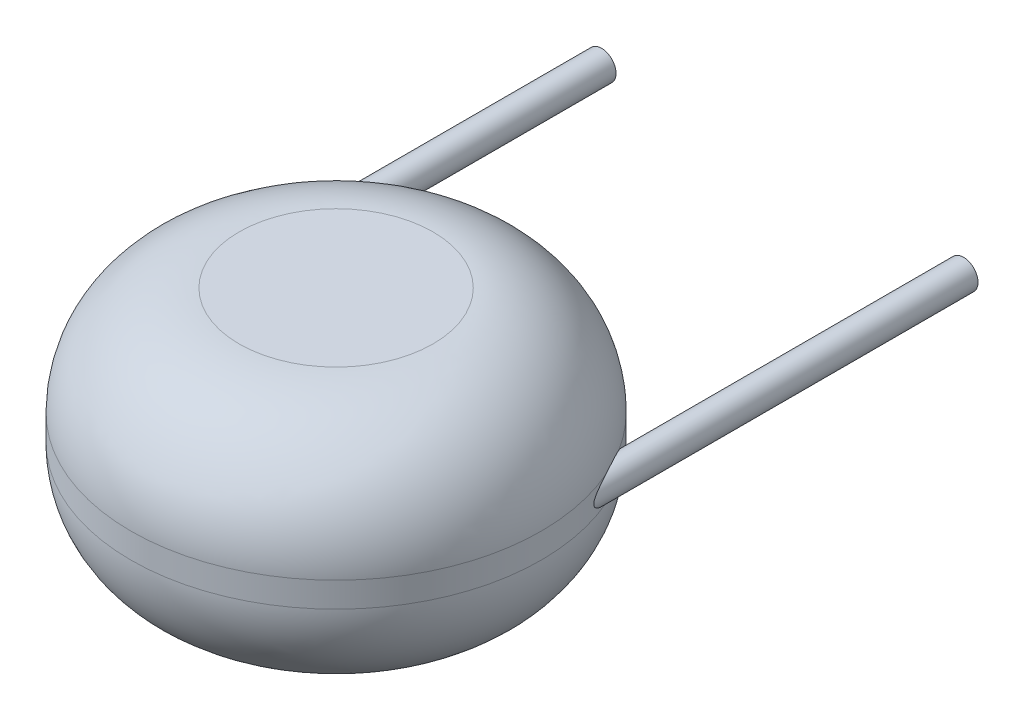
ISO-10303-21;
HEADER;
FILE_DESCRIPTION(('STEP AP214'),'2;1');
FILE_NAME('part.step','',(''),(''),'','','');
FILE_SCHEMA(('AUTOMOTIVE_DESIGN { 1 0 10303 214 1 1 1 1 }'));
ENDSEC;
DATA;
#1=APPLICATION_CONTEXT('core data for automotive mechanical design processes');
#2=APPLICATION_PROTOCOL_DEFINITION('international standard','automotive_design',2000,#1);
#3=PRODUCT_CONTEXT('',#1,'mechanical');
#4=PRODUCT('Part','Part','',(#3));
#5=PRODUCT_RELATED_PRODUCT_CATEGORY('part','',(#4));
#6=PRODUCT_DEFINITION_FORMATION('','',#4);
#7=PRODUCT_DEFINITION_CONTEXT('part definition',#1,'design');
#8=PRODUCT_DEFINITION('design','',#6,#7);
#9=PRODUCT_DEFINITION_SHAPE('','',#8);
#10=(LENGTH_UNIT() NAMED_UNIT(*) SI_UNIT(.MILLI.,.METRE.));
#11=(NAMED_UNIT(*) PLANE_ANGLE_UNIT() SI_UNIT($,.RADIAN.));
#12=(NAMED_UNIT(*) SI_UNIT($,.STERADIAN.) SOLID_ANGLE_UNIT());
#13=UNCERTAINTY_MEASURE_WITH_UNIT(LENGTH_MEASURE(1.E-05),#10,'distance_accuracy_value','');
#14=(GEOMETRIC_REPRESENTATION_CONTEXT(3) GLOBAL_UNCERTAINTY_ASSIGNED_CONTEXT((#13)) GLOBAL_UNIT_ASSIGNED_CONTEXT((#10,
#11,#12)) REPRESENTATION_CONTEXT('',''));
#15=CARTESIAN_POINT('',(0.,0.,0.));
#16=DIRECTION('',(0.,0.,1.));
#17=DIRECTION('',(1.,0.,0.));
#18=AXIS2_PLACEMENT_3D('',#15,#16,#17);
#19=CARTESIAN_POINT('',(3.75,2.5,-9.25));
#20=DIRECTION('',(0.,0.,1.));
#21=DIRECTION('',(1.,0.,0.));
#22=AXIS2_PLACEMENT_3D('',#19,#20,#21);
#23=PLANE('',#22);
#24=CARTESIAN_POINT('',(3.75,2.5,-9.25));
#25=DIRECTION('',(0.,0.,-1.));
#26=DIRECTION('',(-1.,0.,0.));
#27=AXIS2_PLACEMENT_3D('',#24,#25,#26);
#28=CIRCLE('',#27,0.3);
#29=CARTESIAN_POINT('',(3.45,2.5,-9.25));
#30=VERTEX_POINT('',#29);
#31=EDGE_CURVE('E85',#30,#30,#28,.F.);
#32=ORIENTED_EDGE('',*,*,#31,.F.);
#33=EDGE_LOOP('',(#32));
#34=FACE_BOUND('',#33,.T.);
#35=ADVANCED_FACE('F17',(#34),#23,.F.);
#36=CARTESIAN_POINT('',(-3.75,2.5,-9.25));
#37=DIRECTION('',(0.,0.,1.));
#38=DIRECTION('',(1.,0.,0.));
#39=AXIS2_PLACEMENT_3D('',#36,#37,#38);
#40=PLANE('',#39);
#41=CARTESIAN_POINT('',(-3.75,2.5,-9.25));
#42=DIRECTION('',(0.,0.,-1.));
#43=DIRECTION('',(-1.,0.,0.));
#44=AXIS2_PLACEMENT_3D('',#41,#42,#43);
#45=CIRCLE('',#44,0.3);
#46=CARTESIAN_POINT('',(-4.05,2.5,-9.25));
#47=VERTEX_POINT('',#46);
#48=EDGE_CURVE('E101',#47,#47,#45,.F.);
#49=ORIENTED_EDGE('',*,*,#48,.F.);
#50=EDGE_LOOP('',(#49));
#51=FACE_BOUND('',#50,.T.);
#52=ADVANCED_FACE('F296',(#51),#40,.F.);
#53=CARTESIAN_POINT('',(3.75,2.5,4.252));
#54=DIRECTION('',(0.,0.,-1.));
#55=DIRECTION('',(-1.,0.,0.));
#56=AXIS2_PLACEMENT_3D('',#53,#54,#55);
#57=CYLINDRICAL_SURFACE('',#56,0.3);
#58=ORIENTED_EDGE('',*,*,#31,.T.);
#59=EDGE_LOOP('',(#58));
#60=FACE_BOUND('',#59,.T.);
#61=CARTESIAN_POINT('',(3.60033370452902,2.24000000000001,-2.25833948201601));
#62=CARTESIAN_POINT('',(3.59237544483734,2.2445884658662,-2.27102890500092));
#63=CARTESIAN_POINT('',(3.58441716674587,2.24964989207986,-2.28356526340663));
#64=CARTESIAN_POINT('',(3.56855460706408,2.26088976595071,-2.30827475821931));
#65=CARTESIAN_POINT('',(3.5606508873999,2.26707438378381,-2.32044543242139));
#66=CARTESIAN_POINT('',(3.54491959964942,2.28079136736462,-2.34440913329731));
#67=CARTESIAN_POINT('',(3.53709525292746,2.28834364235866,-2.35619304952809));
#68=CARTESIAN_POINT('',(3.52183824347252,2.30488819253633,-2.37893713857757));
#69=CARTESIAN_POINT('',(3.51440462419498,2.31387671032246,-2.38989935405035));
#70=CARTESIAN_POINT('',(3.501390759545,2.33179245232067,-2.40891506163492));
#71=CARTESIAN_POINT('',(3.49571252736562,2.34046055958578,-2.41714347029881));
#72=CARTESIAN_POINT('',(3.48498989706261,2.35898989517244,-2.43257751782839));
#73=CARTESIAN_POINT('',(3.47994399408472,2.36884817676038,-2.43978559046512));
#74=CARTESIAN_POINT('',(3.47067666515606,2.3899416228602,-2.45295111440281));
#75=CARTESIAN_POINT('',(3.46646659419258,2.40119276675623,-2.45889141446202));
#76=CARTESIAN_POINT('',(3.45930435271853,2.42485033803064,-2.46895769046719));
#77=CARTESIAN_POINT('',(3.45634918462002,2.43725392511116,-2.47308799072578));
#78=CARTESIAN_POINT('',(3.45281836813062,2.45815517934173,-2.47801346990059));
#79=CARTESIAN_POINT('',(3.45176760436821,2.46641910712659,-2.47947613088059));
#80=CARTESIAN_POINT('',(3.45035803899449,2.48312047592162,-2.48143725312423));
#81=CARTESIAN_POINT('',(3.44999923192542,2.49155791556269,-2.48193572199289));
#82=CARTESIAN_POINT('',(3.45000108562384,2.51193234135139,-2.48193332594694));
#83=CARTESIAN_POINT('',(3.45072053037973,2.52387396207554,-2.48093409830958));
#84=CARTESIAN_POINT('',(3.4535140166007,2.54728450541962,-2.47704384980731));
#85=CARTESIAN_POINT('',(3.45559028293022,2.55875261870488,-2.47414972174178));
#86=CARTESIAN_POINT('',(3.46085324083906,2.58075310446595,-2.46678227448065));
#87=CARTESIAN_POINT('',(3.46402902513343,2.59129343786678,-2.46232446162049));
#88=CARTESIAN_POINT('',(3.47124532483038,2.61140076570065,-2.45214088984243));
#89=CARTESIAN_POINT('',(3.47528577312467,2.62096783558564,-2.44641522932351));
#90=CARTESIAN_POINT('',(3.48630686932364,2.64388263121362,-2.43069896625517));
#91=CARTESIAN_POINT('',(3.49371574426425,2.65656997634094,-2.42004972458041));
#92=CARTESIAN_POINT('',(3.5094641817965,2.67983725597844,-2.39715599540203));
#93=CARTESIAN_POINT('',(3.51780917010835,2.69040379798474,-2.38490213093792));
#94=CARTESIAN_POINT('',(3.53826127650273,2.71326747633494,-2.35449679855189));
#95=CARTESIAN_POINT('',(3.5505999314385,2.72471345764079,-2.33586451638099));
#96=CARTESIAN_POINT('',(3.56925970510122,2.73957117570398,-2.30716585765084));
#97=CARTESIAN_POINT('',(3.57545099344273,2.74410909155136,-2.29756041821087));
#98=CARTESIAN_POINT('',(3.58787032813877,2.75252706164641,-2.2781174163685));
#99=CARTESIAN_POINT('',(3.59409827959061,2.75640837812631,-2.26828034172332));
#100=CARTESIAN_POINT('',(3.60033370452902,2.75999999999999,-2.25833948201601));
#101=B_SPLINE_CURVE_WITH_KNOTS('',3,(#61,#62,#63,#64,#65,#66,#67,#68,#69,#70,#71,#72,#73,#74,
#75,#76,#77,#78,#79,#80,#81,#82,#83,#84,#85,#86,#87,#88,#89,#90,#91,#92,#93,#94,#95,#96,#97,#98,
#99,#100),.UNSPECIFIED.,.F.,.F.,(4,2,2,2,2,2,2,2,2,2,2,2,2,2,2,2,2,2,2,4),(0.,
0.0470106891256236,0.0942879015129488,0.142318612183013,0.190225665834799,0.229833753870268,
0.269345714012529,0.309362389662058,0.349282932276007,0.374578900701871,0.399874669606179,
0.435628605918173,0.471441317786004,0.506908488838162,0.542372908210544,0.596503046156255,
0.650964937877654,0.725974473698545,0.762849543623875,0.799652899690031),.UNSPECIFIED.);
#102=CARTESIAN_POINT('',(3.60033370452903,2.24000000000001,-2.25833948201599));
#103=VERTEX_POINT('',#102);
#104=CARTESIAN_POINT('',(3.60033370452902,2.76,-2.25833948201601));
#105=VERTEX_POINT('',#104);
#106=EDGE_CURVE('E69',#103,#105,#101,.T.);
#107=ORIENTED_EDGE('',*,*,#106,.T.);
#108=CARTESIAN_POINT('',(3.89966629547111,2.75999999999992,-1.68970493991307));
#109=CARTESIAN_POINT('',(3.88340026065117,2.76931981640486,-1.72724234266036));
#110=CARTESIAN_POINT('',(3.8663971647586,2.77711981512702,-1.7648538559337));
#111=CARTESIAN_POINT('',(3.83099810863401,2.78947983459557,-1.84014072611238));
#112=CARTESIAN_POINT('',(3.81259680514515,2.79402665535172,-1.87781572828809));
#113=CARTESIAN_POINT('',(3.77517376353951,2.79951924919928,-1.95173730869121));
#114=CARTESIAN_POINT('',(3.75618609511949,2.80056681325137,-1.98799335308594));
#115=CARTESIAN_POINT('',(3.71729418763469,2.79884681889486,-2.05986120906395));
#116=CARTESIAN_POINT('',(3.69739177774562,2.7960865792098,-2.0954741235953));
#117=CARTESIAN_POINT('',(3.66459612263311,2.78787838538539,-2.15230348002395));
#118=CARTESIAN_POINT('',(3.65191552232845,2.78385164927381,-2.17384461189075));
#119=CARTESIAN_POINT('',(3.62627821231686,2.77364447603275,-2.21651168053552));
#120=CARTESIAN_POINT('',(3.61332004278759,2.76744489530502,-2.23763210233189));
#121=CARTESIAN_POINT('',(3.60033370452902,2.76000000000001,-2.25833948201601));
#122=B_SPLINE_CURVE_WITH_KNOTS('',3,(#108,#109,#110,#111,#112,#113,#114,#115,#116,#117,#118,
#119,#120,#121),.UNSPECIFIED.,.F.,.F.,(4,2,2,2,2,2,4),(0.,0.125863012458723,0.252233870191085,
0.374895100979937,0.497320901054593,0.573191442164693,0.649747970091214),.UNSPECIFIED.);
#123=CARTESIAN_POINT('',(3.89966629547111,2.75999999999991,-1.68970493991307));
#124=VERTEX_POINT('',#123);
#125=EDGE_CURVE('E81',#124,#105,#122,.T.);
#126=ORIENTED_EDGE('',*,*,#125,.F.);
#127=CARTESIAN_POINT('',(3.89966629547111,2.75999999999991,-1.68970493991307));
#128=CARTESIAN_POINT('',(3.9095683983833,2.75428092283888,-1.66685600074507));
#129=CARTESIAN_POINT('',(3.91921915152432,2.74798877754456,-1.64402857986942));
#130=CARTESIAN_POINT('',(3.93803039003501,2.7340618368238,-1.59844418329482));
#131=CARTESIAN_POINT('',(3.94718827213643,2.72642068093233,-1.57568808544314));
#132=CARTESIAN_POINT('',(3.96500392650231,2.7095811455871,-1.53030848095611));
#133=CARTESIAN_POINT('',(3.97365686148796,2.70037024608618,-1.5076876860259));
#134=CARTESIAN_POINT('',(3.99029639699377,2.68008654077517,-1.46307795820514));
#135=CARTESIAN_POINT('',(3.9982844332677,2.66901791117513,-1.44108773479613));
#136=CARTESIAN_POINT('',(4.00949201617188,2.6507035307258,-1.40946547804119));
#137=CARTESIAN_POINT('',(4.01302837093956,2.64446900932016,-1.39936178080964));
#138=CARTESIAN_POINT('',(4.0198797535611,2.63122816494284,-1.37955654507073));
#139=CARTESIAN_POINT('',(4.02319437776553,2.62422049278016,-1.3698557515771));
#140=CARTESIAN_POINT('',(4.02955589468088,2.60916148543524,-1.35102885802617));
#141=CARTESIAN_POINT('',(4.03259987067499,2.60110066462687,-1.34190926327646));
#142=CARTESIAN_POINT('',(4.03823875301608,2.5836783003258,-1.32484230384555));
#143=CARTESIAN_POINT('',(4.04083547709001,2.57432231468086,-1.3168902146211));
#144=CARTESIAN_POINT('',(4.04418928905937,2.55899319917847,-1.30654003566674));
#145=CARTESIAN_POINT('',(4.04522170298147,2.55363019765773,-1.30333810519714));
#146=CARTESIAN_POINT('',(4.04703220230964,2.54247033258221,-1.29770528787979));
#147=CARTESIAN_POINT('',(4.04781066741657,2.53667413283831,-1.29527325006153));
#148=CARTESIAN_POINT('',(4.04893348317314,2.52575608621923,-1.29175868862616));
#149=CARTESIAN_POINT('',(4.04932979819215,2.52069236517749,-1.29051499035192));
#150=CARTESIAN_POINT('',(4.04986303425304,2.51041952354021,-1.28884063911642));
#151=CARTESIAN_POINT('',(4.05000017584199,2.5052105304003,-1.28840929487282));
#152=CARTESIAN_POINT('',(4.04999979595767,2.49395384017565,-1.2884105431358));
#153=CARTESIAN_POINT('',(4.04981469866944,2.48790561048148,-1.28899278192601));
#154=CARTESIAN_POINT('',(4.04910054923731,2.47603157206861,-1.29123430335086));
#155=CARTESIAN_POINT('',(4.04857083679252,2.47020621311658,-1.29289565361051));
#156=CARTESIAN_POINT('',(4.04705272127521,2.45744162073439,-1.29764086715074));
#157=CARTESIAN_POINT('',(4.04598046806868,2.45061080071853,-1.30098349307691));
#158=CARTESIAN_POINT('',(4.04351108744379,2.43758711142997,-1.30863839038639));
#159=CARTESIAN_POINT('',(4.04211323792573,2.4313957049433,-1.31295281629249));
#160=CARTESIAN_POINT('',(4.03783216355387,2.4146898777529,-1.32608062716702));
#161=CARTESIAN_POINT('',(4.03467918198218,2.40485351556987,-1.33565553745419));
#162=CARTESIAN_POINT('',(4.02791353622071,2.3866052908307,-1.35592367843878));
#163=CARTESIAN_POINT('',(4.02429928419923,2.37819859449795,-1.36662074816279));
#164=CARTESIAN_POINT('',(4.01474798451078,2.35826743967008,-1.39449418241345));
#165=CARTESIAN_POINT('',(4.008595205267,2.34745241811612,-1.41209942245775));
#166=CARTESIAN_POINT('',(3.99574364381122,2.32752094077965,-1.44806833606058));
#167=CARTESIAN_POINT('',(3.98904369089645,2.31840827174939,-1.46643359201299));
#168=CARTESIAN_POINT('',(3.96822626200268,2.29296652893955,-1.52225237399326));
#169=CARTESIAN_POINT('',(3.95341999632298,2.27858660829821,-1.56034407156265));
#170=CARTESIAN_POINT('',(3.93170244413849,2.26116042953125,-1.61384232482941));
#171=CARTESIAN_POINT('',(3.92543139321043,2.25651904238427,-1.62903733686645));
#172=CARTESIAN_POINT('',(3.91269955316773,2.24783243630183,-1.65938223856124));
#173=CARTESIAN_POINT('',(3.90624043272056,2.24378320827457,-1.67453167929608));
#174=CARTESIAN_POINT('',(3.89966629547111,2.24000000000009,-1.68970493991307));
#175=B_SPLINE_CURVE_WITH_KNOTS('',3,(#127,#128,#129,#130,#131,#132,#133,#134,#135,#136,#137,
#138,#139,#140,#141,#142,#143,#144,#145,#146,#147,#148,#149,#150,#151,#152,#153,#154,#155,#156,
#157,#158,#159,#160,#161,#162,#163,#164,#165,#166,#167,#168,#169,#170,#171,#172,#173,#174),
.UNSPECIFIED.,.F.,.F.,(4,2,2,2,2,2,2,2,2,2,2,2,2,2,2,2,2,2,2,2,2,2,2,4),(0.,0.0766620981577847,
0.153695805246235,0.231375438010917,0.308882728825192,0.346024111249623,0.383231364429539,
0.420800407227256,0.458212961094156,0.477156092421279,0.496070769011759,0.511694609004088,
0.527305147685487,0.545419198359717,0.56356805914255,0.586475407519412,0.609434051294322,
0.651451840352009,0.693618378832947,0.758136165749392,0.822795801746839,0.952424484467958,
1.00366360278707,1.05453793082454),.UNSPECIFIED.);
#176=CARTESIAN_POINT('',(3.89966629547111,2.24000000000005,-1.68970493991306));
#177=VERTEX_POINT('',#176);
#178=EDGE_CURVE('E76',#124,#177,#175,.T.);
#179=ORIENTED_EDGE('',*,*,#178,.T.);
#180=CARTESIAN_POINT('',(3.89966629547111,2.24000000000009,-1.68970493991307));
#181=CARTESIAN_POINT('',(3.88340026065117,2.23068018359513,-1.72724234266036));
#182=CARTESIAN_POINT('',(3.8663971647586,2.22288018487298,-1.7648538559337));
#183=CARTESIAN_POINT('',(3.83099810863401,2.21052016540443,-1.84014072611238));
#184=CARTESIAN_POINT('',(3.81259680514515,2.20597334464829,-1.87781572828809));
#185=CARTESIAN_POINT('',(3.7751737635395,2.20048075080072,-1.95173730869121));
#186=CARTESIAN_POINT('',(3.75618609511949,2.19943318674862,-1.98799335308594));
#187=CARTESIAN_POINT('',(3.71729418763469,2.20115318110515,-2.05986120906396));
#188=CARTESIAN_POINT('',(3.69739177774563,2.20391342079023,-2.09547412359531));
#189=CARTESIAN_POINT('',(3.66459612263311,2.21212161461464,-2.15230348002396));
#190=CARTESIAN_POINT('',(3.65191552232845,2.2161483507262,-2.17384461189076));
#191=CARTESIAN_POINT('',(3.62627821231685,2.22635552396724,-2.21651168053553));
#192=CARTESIAN_POINT('',(3.61332004278758,2.23255510469497,-2.23763210233189));
#193=CARTESIAN_POINT('',(3.60033370452902,2.24,-2.25833948201601));
#194=B_SPLINE_CURVE_WITH_KNOTS('',3,(#180,#181,#182,#183,#184,#185,#186,#187,#188,#189,#190,
#191,#192,#193),.UNSPECIFIED.,.F.,.F.,(4,2,2,2,2,2,4),(0.,0.125863012458731,0.252233870191088,
0.374895100979942,0.497320901054607,0.573191442164699,0.649747970091211),.UNSPECIFIED.);
#195=EDGE_CURVE('E79',#177,#103,#194,.T.);
#196=ORIENTED_EDGE('',*,*,#195,.T.);
#197=EDGE_LOOP('',(#107,#126,#179,#196));
#198=FACE_BOUND('',#197,.T.);
#199=ADVANCED_FACE('F78',(#60,#198),#57,.T.);
#200=CARTESIAN_POINT('',(-3.75,2.5,4.252));
#201=DIRECTION('',(0.,0.,-1.));
#202=DIRECTION('',(-1.,0.,0.));
#203=AXIS2_PLACEMENT_3D('',#200,#201,#202);
#204=CYLINDRICAL_SURFACE('',#203,0.3);
#205=ORIENTED_EDGE('',*,*,#48,.T.);
#206=EDGE_LOOP('',(#205));
#207=FACE_BOUND('',#206,.T.);
#208=CARTESIAN_POINT('',(-3.89966629547111,2.24000000000009,-1.68970493991307));
#209=CARTESIAN_POINT('',(-3.9095683983833,2.24571907716112,-1.66685600074507));
#210=CARTESIAN_POINT('',(-3.91921915152432,2.25201122245544,-1.64402857986942));
#211=CARTESIAN_POINT('',(-3.93803039003501,2.2659381631762,-1.59844418329481));
#212=CARTESIAN_POINT('',(-3.94718827213643,2.27357931906767,-1.57568808544313));
#213=CARTESIAN_POINT('',(-3.96500392650231,2.29041885441291,-1.5303084809561));
#214=CARTESIAN_POINT('',(-3.97365686148797,2.29962975391382,-1.50768768602589));
#215=CARTESIAN_POINT('',(-3.99029639699377,2.31991345922483,-1.46307795820514));
#216=CARTESIAN_POINT('',(-3.9982844332677,2.33098208882487,-1.44108773479613));
#217=CARTESIAN_POINT('',(-4.0094920161719,2.34929646927424,-1.40946547804113));
#218=CARTESIAN_POINT('',(-4.0130283709396,2.35553099067992,-1.39936178080952));
#219=CARTESIAN_POINT('',(-4.01987975356119,2.36877183505734,-1.37955654507048));
#220=CARTESIAN_POINT('',(-4.02319437776564,2.37577950722006,-1.36985575157679));
#221=CARTESIAN_POINT('',(-4.02955589468102,2.39083851456511,-1.35102885802575));
#222=CARTESIAN_POINT('',(-4.03259987067515,2.39889933537355,-1.341909263276));
#223=CARTESIAN_POINT('',(-4.03823875301626,2.4163216996748,-1.32484230384501));
#224=CARTESIAN_POINT('',(-4.04083547709019,2.42567768531984,-1.31689021462055));
#225=CARTESIAN_POINT('',(-4.04418928905954,2.44100680082236,-1.30654003566622));
#226=CARTESIAN_POINT('',(-4.04522170298162,2.44636980234313,-1.30333810519665));
#227=CARTESIAN_POINT('',(-4.04703220230977,2.45752966741871,-1.29770528787938));
#228=CARTESIAN_POINT('',(-4.04781066741669,2.46332586716263,-1.29527325006117));
#229=CARTESIAN_POINT('',(-4.04893348317318,2.4742439137813,-1.29175868862604));
#230=CARTESIAN_POINT('',(-4.04932979819215,2.47930763482259,-1.29051499035193));
#231=CARTESIAN_POINT('',(-4.04986303425301,2.48958047645893,-1.28884063911654));
#232=CARTESIAN_POINT('',(-4.05000017584195,2.49478946959837,-1.28840929487292));
#233=CARTESIAN_POINT('',(-4.04999979595771,2.50604615982244,-1.28841054313568));
#234=CARTESIAN_POINT('',(-4.04981469866952,2.51209438951653,-1.28899278192576));
#235=CARTESIAN_POINT('',(-4.04910054923748,2.52396842792925,-1.29123430335033));
#236=CARTESIAN_POINT('',(-4.04857083679274,2.52979378688122,-1.29289565360982));
#237=CARTESIAN_POINT('',(-4.04705272127555,2.5425583792632,-1.29764086714967));
#238=CARTESIAN_POINT('',(-4.04598046806911,2.54938919927892,-1.30098349307559));
#239=CARTESIAN_POINT('',(-4.04351108744438,2.56241288856725,-1.30863839038457));
#240=CARTESIAN_POINT('',(-4.04211323792641,2.56860429505381,-1.31295281629041));
#241=CARTESIAN_POINT('',(-4.03783216355485,2.58531012224375,-1.32608062716405));
#242=CARTESIAN_POINT('',(-4.03467918198339,2.59514648442648,-1.33565553745053));
#243=CARTESIAN_POINT('',(-4.0279135362224,2.61339470916513,-1.35592367843376));
#244=CARTESIAN_POINT('',(-4.02429928420117,2.62180140549766,-1.36662074815707));
#245=CARTESIAN_POINT('',(-4.01474798451344,2.64173256032489,-1.39449418240576));
#246=CARTESIAN_POINT('',(-4.00859520527015,2.65254758187849,-1.41209942244877));
#247=CARTESIAN_POINT('',(-3.99574364381541,2.67247905921435,-1.44806833604902));
#248=CARTESIAN_POINT('',(-3.98904369090117,2.68159172824437,-1.46643359200013));
#249=CARTESIAN_POINT('',(-3.96822626200907,2.70703347105361,-1.52225237397654));
#250=CARTESIAN_POINT('',(-3.95341999633056,2.72141339169474,-1.56034407154337));
#251=CARTESIAN_POINT('',(-3.93170244414597,2.73883957046313,-1.61384232481122));
#252=CARTESIAN_POINT('',(-3.92543139321648,2.74348095761143,-1.62903733685191));
#253=CARTESIAN_POINT('',(-3.91269955317083,2.75216756369623,-1.65938223855399));
#254=CARTESIAN_POINT('',(-3.90624043272214,2.75621679172452,-1.67453167929244));
#255=CARTESIAN_POINT('',(-3.89966629547111,2.75999999999991,-1.68970493991307));
#256=B_SPLINE_CURVE_WITH_KNOTS('',3,(#208,#209,#210,#211,#212,#213,#214,#215,#216,#217,#218,
#219,#220,#221,#222,#223,#224,#225,#226,#227,#228,#229,#230,#231,#232,#233,#234,#235,#236,#237,
#238,#239,#240,#241,#242,#243,#244,#245,#246,#247,#248,#249,#250,#251,#252,#253,#254,#255),
.UNSPECIFIED.,.F.,.F.,(4,2,2,2,2,2,2,2,2,2,2,2,2,2,2,2,2,2,2,2,2,2,2,4),(0.,0.0766620981577916,
0.153695805246249,0.231375438010922,0.308882728825189,0.346024111249856,0.383231364430015,
0.420800407227987,0.458212961095137,0.47715609242228,0.496070769012772,0.511694609003693,
0.527305147683691,0.545419198357615,0.563568059140138,0.586475407516282,0.609434051290472,
0.651451840346,0.69361837882477,0.758136165737105,0.82279580173043,0.952424484443393,
1.0036636027749,1.05453793082456),.UNSPECIFIED.);
#257=CARTESIAN_POINT('',(-3.89966629547103,2.24000000000004,-1.68970493991324));
#258=VERTEX_POINT('',#257);
#259=CARTESIAN_POINT('',(-3.89966629547111,2.75999999999991,-1.68970493991307));
#260=VERTEX_POINT('',#259);
#261=EDGE_CURVE('E95',#258,#260,#256,.T.);
#262=ORIENTED_EDGE('',*,*,#261,.T.);
#263=CARTESIAN_POINT('',(-3.60033370452902,2.76,-2.25833948201601));
#264=CARTESIAN_POINT('',(-3.61276880738169,2.76713110347989,-2.23851154417067));
#265=CARTESIAN_POINT('',(-3.62518110852339,2.77311904637575,-2.21829930755388));
#266=CARTESIAN_POINT('',(-3.64983671985179,2.78310304038877,-2.17733787202072));
#267=CARTESIAN_POINT('',(-3.66208030858741,2.78710289131652,-2.15658977778715));
#268=CARTESIAN_POINT('',(-3.68614596297736,2.79338379962214,-2.11501754007277));
#269=CARTESIAN_POINT('',(-3.69797157642712,2.79568918478728,-2.09419896624966));
#270=CARTESIAN_POINT('',(-3.72133681622593,2.79886011038323,-2.05228365326702));
#271=CARTESIAN_POINT('',(-3.73287626484359,2.79972477703522,-2.0311867531169));
#272=CARTESIAN_POINT('',(-3.77228039947014,2.80048735677103,-1.95775495150415));
#273=CARTESIAN_POINT('',(-3.79931258308618,2.79711666681303,-1.90490486031212));
#274=CARTESIAN_POINT('',(-3.83819588160296,2.78706124799909,-1.82490767214291));
#275=CARTESIAN_POINT('',(-3.8509919724956,2.78281164242296,-1.79786307329456));
#276=CARTESIAN_POINT('',(-3.87587230998366,2.77264546505084,-1.74377256976192));
#277=CARTESIAN_POINT('',(-3.88795683015792,2.76672953903474,-1.71672666963381));
#278=CARTESIAN_POINT('',(-3.89966629547111,2.75999999999993,-1.68970493991307));
#279=B_SPLINE_CURVE_WITH_KNOTS('',3,(#263,#264,#265,#266,#267,#268,#269,#270,#271,#272,#273,
#274,#275,#276,#277,#278),.UNSPECIFIED.,.F.,.F.,(4,2,2,2,2,2,2,4),(0.,0.0733227072357572,
0.146504729749788,0.21861436513813,0.290767718274411,0.468554389719381,0.559173436247972,
0.64975741171366),.UNSPECIFIED.);
#280=CARTESIAN_POINT('',(-3.60033370452902,2.76,-2.25833948201601));
#281=VERTEX_POINT('',#280);
#282=EDGE_CURVE('E140',#281,#260,#279,.T.);
#283=ORIENTED_EDGE('',*,*,#282,.F.);
#284=CARTESIAN_POINT('',(-3.60033370452902,2.75999999999999,-2.25833948201601));
#285=CARTESIAN_POINT('',(-3.59237544483734,2.7554115341338,-2.27102890500092));
#286=CARTESIAN_POINT('',(-3.58441716674587,2.75035010792014,-2.28356526340663));
#287=CARTESIAN_POINT('',(-3.56855460706408,2.73911023404929,-2.30827475821931));
#288=CARTESIAN_POINT('',(-3.5606508873999,2.73292561621619,-2.32044543242139));
#289=CARTESIAN_POINT('',(-3.54491959964942,2.71920863263538,-2.34440913329731));
#290=CARTESIAN_POINT('',(-3.53709525292746,2.71165635764134,-2.35619304952809));
#291=CARTESIAN_POINT('',(-3.52183824347252,2.69511180746367,-2.37893713857757));
#292=CARTESIAN_POINT('',(-3.51440462419498,2.68612328967754,-2.38989935405036));
#293=CARTESIAN_POINT('',(-3.501390759545,2.66820754767933,-2.40891506163492));
#294=CARTESIAN_POINT('',(-3.49571252736562,2.65953944041422,-2.41714347029881));
#295=CARTESIAN_POINT('',(-3.48498989706261,2.64101010482756,-2.43257751782839));
#296=CARTESIAN_POINT('',(-3.47994399408472,2.63115182323962,-2.43978559046512));
#297=CARTESIAN_POINT('',(-3.47067666515606,2.6100583771398,-2.45295111440281));
#298=CARTESIAN_POINT('',(-3.46646659419258,2.59880723324377,-2.45889141446202));
#299=CARTESIAN_POINT('',(-3.45930435271853,2.57514966196936,-2.46895769046719));
#300=CARTESIAN_POINT('',(-3.45634918462002,2.56274607488884,-2.47308799072578));
#301=CARTESIAN_POINT('',(-3.45281836813062,2.54184482065827,-2.47801346990059));
#302=CARTESIAN_POINT('',(-3.45176760436821,2.53358089287341,-2.47947613088059));
#303=CARTESIAN_POINT('',(-3.45035803899449,2.51687952407838,-2.48143725312423));
#304=CARTESIAN_POINT('',(-3.44999923192542,2.50844208443731,-2.48193572199288));
#305=CARTESIAN_POINT('',(-3.45000108562384,2.48806765864861,-2.48193332594694));
#306=CARTESIAN_POINT('',(-3.45072053037973,2.47612603792446,-2.48093409830958));
#307=CARTESIAN_POINT('',(-3.4535140166007,2.45271549458038,-2.47704384980731));
#308=CARTESIAN_POINT('',(-3.45559028293022,2.44124738129512,-2.47414972174178));
#309=CARTESIAN_POINT('',(-3.46085324083906,2.41924689553405,-2.46678227448065));
#310=CARTESIAN_POINT('',(-3.46402902513343,2.40870656213322,-2.46232446162049));
#311=CARTESIAN_POINT('',(-3.47124532483038,2.38859923429935,-2.45214088984243));
#312=CARTESIAN_POINT('',(-3.47528577312467,2.37903216441436,-2.44641522932351));
#313=CARTESIAN_POINT('',(-3.48630686932364,2.35611736878638,-2.43069896625516));
#314=CARTESIAN_POINT('',(-3.49371574426425,2.34343002365906,-2.42004972458041));
#315=CARTESIAN_POINT('',(-3.5094641817965,2.32016274402155,-2.39715599540203));
#316=CARTESIAN_POINT('',(-3.51780917010835,2.30959620201526,-2.38490213093792));
#317=CARTESIAN_POINT('',(-3.53826127650273,2.28673252366506,-2.35449679855189));
#318=CARTESIAN_POINT('',(-3.5505999314385,2.27528654235921,-2.33586451638099));
#319=CARTESIAN_POINT('',(-3.56925970510122,2.26042882429602,-2.30716585765084));
#320=CARTESIAN_POINT('',(-3.57545099344273,2.25589090844864,-2.29756041821087));
#321=CARTESIAN_POINT('',(-3.58787032813877,2.24747293835359,-2.2781174163685));
#322=CARTESIAN_POINT('',(-3.59409827959061,2.24359162187369,-2.26828034172332));
#323=CARTESIAN_POINT('',(-3.60033370452902,2.24000000000001,-2.25833948201601));
#324=B_SPLINE_CURVE_WITH_KNOTS('',3,(#284,#285,#286,#287,#288,#289,#290,#291,#292,#293,#294,
#295,#296,#297,#298,#299,#300,#301,#302,#303,#304,#305,#306,#307,#308,#309,#310,#311,#312,#313,
#314,#315,#316,#317,#318,#319,#320,#321,#322,#323),.UNSPECIFIED.,.F.,.F.,(4,2,2,2,2,2,2,2,2,2,2,
2,2,2,2,2,2,2,2,4),(0.,0.0470106891256243,0.0942879015129498,0.142318612183014,
0.190225665834799,0.229833753870268,0.269345714012529,0.309362389662059,0.349282932276007,
0.374578900701871,0.399874669606179,0.435628605918174,0.471441317786005,0.506908488838162,
0.542372908210545,0.596503046156256,0.650964937877655,0.725974473698545,0.762849543623876,
0.799652899690032),.UNSPECIFIED.);
#325=CARTESIAN_POINT('',(-3.60033370452903,2.24,-2.25833948201599));
#326=VERTEX_POINT('',#325);
#327=EDGE_CURVE('E104',#281,#326,#324,.T.);
#328=ORIENTED_EDGE('',*,*,#327,.T.);
#329=CARTESIAN_POINT('',(-3.60033370452902,2.24,-2.25833948201601));
#330=CARTESIAN_POINT('',(-3.61276880738169,2.23286889652011,-2.23851154417067));
#331=CARTESIAN_POINT('',(-3.62518110852339,2.22688095362425,-2.21829930755388));
#332=CARTESIAN_POINT('',(-3.64983671985179,2.21689695961123,-2.17733787202072));
#333=CARTESIAN_POINT('',(-3.66208030858741,2.21289710868347,-2.15658977778715));
#334=CARTESIAN_POINT('',(-3.68614596297736,2.20661620037786,-2.11501754007277));
#335=CARTESIAN_POINT('',(-3.69797157642712,2.20431081521273,-2.09419896624966));
#336=CARTESIAN_POINT('',(-3.72133681622593,2.20113988961677,-2.05228365326702));
#337=CARTESIAN_POINT('',(-3.73287626484359,2.20027522296477,-2.0311867531169));
#338=CARTESIAN_POINT('',(-3.77228039947014,2.19951264322897,-1.95775495150415));
#339=CARTESIAN_POINT('',(-3.79931258308618,2.20288333318697,-1.90490486031212));
#340=CARTESIAN_POINT('',(-3.83819588160295,2.21293875200091,-1.82490767214291));
#341=CARTESIAN_POINT('',(-3.8509919724956,2.21718835757704,-1.79786307329456));
#342=CARTESIAN_POINT('',(-3.87587230998366,2.22735453494916,-1.74377256976192));
#343=CARTESIAN_POINT('',(-3.88795683015792,2.23327046096526,-1.71672666963381));
#344=CARTESIAN_POINT('',(-3.89966629547111,2.24000000000008,-1.68970493991307));
#345=B_SPLINE_CURVE_WITH_KNOTS('',3,(#329,#330,#331,#332,#333,#334,#335,#336,#337,#338,#339,
#340,#341,#342,#343,#344),.UNSPECIFIED.,.F.,.F.,(4,2,2,2,2,2,2,4),(0.,0.0733227072357569,
0.146504729749788,0.218614365138131,0.290767718274411,0.46855438971938,0.559173436247972,
0.649757411713659),.UNSPECIFIED.);
#346=EDGE_CURVE('E86',#326,#258,#345,.T.);
#347=ORIENTED_EDGE('',*,*,#346,.T.);
#348=EDGE_LOOP('',(#262,#283,#328,#347));
#349=FACE_BOUND('',#348,.T.);
#350=ADVANCED_FACE('F124',(#207,#349),#204,.T.);
#351=CARTESIAN_POINT('',(0.,5.,0.));
#352=DIRECTION('',(0.,1.,0.));
#353=DIRECTION('',(0.,0.,1.));
#354=AXIS2_PLACEMENT_3D('',#351,#352,#353);
#355=PLANE('',#354);
#356=CARTESIAN_POINT('',(0.,5.,0.));
#357=DIRECTION('',(0.,-1.,0.));
#358=DIRECTION('',(0.,0.,-1.));
#359=AXIS2_PLACEMENT_3D('',#356,#357,#358);
#360=CIRCLE('',#359,2.01);
#361=CARTESIAN_POINT('',(0.,5.,-2.01));
#362=VERTEX_POINT('',#361);
#363=CARTESIAN_POINT('',(0.,5.,2.01));
#364=VERTEX_POINT('',#363);
#365=EDGE_CURVE('E100',#362,#364,#360,.T.);
#366=ORIENTED_EDGE('',*,*,#365,.F.);
#367=CARTESIAN_POINT('',(0.,5.,0.));
#368=DIRECTION('',(0.,-1.,0.));
#369=DIRECTION('',(0.,0.,1.));
#370=AXIS2_PLACEMENT_3D('',#367,#368,#369);
#371=CIRCLE('',#370,2.01);
#372=EDGE_CURVE('E146',#364,#362,#371,.T.);
#373=ORIENTED_EDGE('',*,*,#372,.F.);
#374=EDGE_LOOP('',(#366,#373));
#375=FACE_BOUND('',#374,.T.);
#376=ADVANCED_FACE('F128',(#375),#355,.T.);
#377=CARTESIAN_POINT('',(0.,2.76,4.25));
#378=CARTESIAN_POINT('',(0.,3.053215314335,4.25));
#379=CARTESIAN_POINT('',(0.,3.34643013892,4.203942026794));
#380=CARTESIAN_POINT('',(0.,3.630604371232,4.11182488049));
#381=CARTESIAN_POINT('',(0.,3.896682556753,3.976020012598));
#382=CARTESIAN_POINT('',(0.,4.136584652744,3.801253726972));
#383=CARTESIAN_POINT('',(0.,4.551253726972,3.386584652744));
#384=CARTESIAN_POINT('',(0.,4.726020012598,3.146682556753));
#385=CARTESIAN_POINT('',(0.,4.86182488049,2.880604371232));
#386=CARTESIAN_POINT('',(0.,4.953942026794,2.59643013892));
#387=CARTESIAN_POINT('',(0.,5.,2.303215314335));
#388=CARTESIAN_POINT('',(0.,5.,2.01));
#389=(BOUNDED_CURVE() B_SPLINE_CURVE(6,(#377,#378,#379,#380,#381,#382,#383,#384,#385,#386,#387,
#388),.UNSPECIFIED.,.F.,.F.) B_SPLINE_CURVE_WITH_KNOTS((7,5,7),(0.,0.785398163397,
1.570796326795),
.UNSPECIFIED.) CURVE() GEOMETRIC_REPRESENTATION_ITEM() RATIONAL_B_SPLINE_CURVE((1.,1.,1.,1.,1.,
1.,1.,1.,1.,1.,1.,1.)) REPRESENTATION_ITEM(''));
#390=CARTESIAN_POINT('',(0.,2.76,0.));
#391=DIRECTION('',(0.,-1.,0.));
#392=AXIS1_PLACEMENT('',#390,#391);
#393=SURFACE_OF_REVOLUTION('',#389,#392);
#394=CARTESIAN_POINT('',(0.,2.76,0.));
#395=DIRECTION('',(0.,-1.,0.));
#396=DIRECTION('',(0.,0.,-1.));
#397=AXIS2_PLACEMENT_3D('',#394,#395,#396);
#398=CIRCLE('',#397,4.25);
#399=EDGE_CURVE('E201',#281,#105,#398,.T.);
#400=ORIENTED_EDGE('',*,*,#399,.F.);
#401=ORIENTED_EDGE('',*,*,#282,.T.);
#402=CARTESIAN_POINT('',(0.,2.76,0.));
#403=DIRECTION('',(0.,-1.,0.));
#404=DIRECTION('',(0.,0.,-1.));
#405=AXIS2_PLACEMENT_3D('',#402,#403,#404);
#406=CIRCLE('',#405,4.25);
#407=EDGE_CURVE('E96',#124,#260,#406,.T.);
#408=ORIENTED_EDGE('',*,*,#407,.F.);
#409=ORIENTED_EDGE('',*,*,#125,.T.);
#410=EDGE_LOOP('',(#400,#401,#408,#409));
#411=FACE_BOUND('',#410,.T.);
#412=ORIENTED_EDGE('',*,*,#372,.T.);
#413=ORIENTED_EDGE('',*,*,#365,.T.);
#414=EDGE_LOOP('',(#412,#413));
#415=FACE_BOUND('',#414,.T.);
#416=ADVANCED_FACE('F150',(#411,#415),#393,.F.);
#417=CARTESIAN_POINT('',(0.,0.,0.));
#418=DIRECTION('',(0.,1.,0.));
#419=DIRECTION('',(0.,0.,1.));
#420=AXIS2_PLACEMENT_3D('',#417,#418,#419);
#421=PLANE('',#420);
#422=CARTESIAN_POINT('',(0.,0.,0.));
#423=DIRECTION('',(0.,1.,0.));
#424=DIRECTION('',(0.,0.,1.));
#425=AXIS2_PLACEMENT_3D('',#422,#423,#424);
#426=CIRCLE('',#425,2.01);
#427=CARTESIAN_POINT('',(0.,0.,2.01));
#428=VERTEX_POINT('',#427);
#429=CARTESIAN_POINT('',(0.,0.,-2.01));
#430=VERTEX_POINT('',#429);
#431=EDGE_CURVE('E211',#428,#430,#426,.T.);
#432=ORIENTED_EDGE('',*,*,#431,.F.);
#433=CARTESIAN_POINT('',(0.,0.,0.));
#434=DIRECTION('',(0.,1.,0.));
#435=DIRECTION('',(0.,0.,-1.));
#436=AXIS2_PLACEMENT_3D('',#433,#434,#435);
#437=CIRCLE('',#436,2.01);
#438=EDGE_CURVE('E36',#430,#428,#437,.T.);
#439=ORIENTED_EDGE('',*,*,#438,.F.);
#440=EDGE_LOOP('',(#432,#439));
#441=FACE_BOUND('',#440,.T.);
#442=ADVANCED_FACE('F155',(#441),#421,.F.);
#443=CARTESIAN_POINT('',(0.,5.,0.));
#444=DIRECTION('',(0.,-1.,0.));
#445=DIRECTION('',(0.,0.,-1.));
#446=AXIS2_PLACEMENT_3D('',#443,#444,#445);
#447=CYLINDRICAL_SURFACE('',#446,4.25);
#448=ORIENTED_EDGE('',*,*,#106,.F.);
#449=CARTESIAN_POINT('',(0.,2.24,0.));
#450=DIRECTION('',(0.,-1.,0.));
#451=DIRECTION('',(0.,0.,1.));
#452=AXIS2_PLACEMENT_3D('',#449,#450,#451);
#453=CIRCLE('',#452,4.25);
#454=EDGE_CURVE('E28',#326,#103,#453,.T.);
#455=ORIENTED_EDGE('',*,*,#454,.F.);
#456=ORIENTED_EDGE('',*,*,#327,.F.);
#457=ORIENTED_EDGE('',*,*,#399,.T.);
#458=EDGE_LOOP('',(#448,#455,#456,#457));
#459=FACE_BOUND('',#458,.T.);
#460=ADVANCED_FACE('F268',(#459),#447,.T.);
#461=CARTESIAN_POINT('',(0.,5.,0.));
#462=DIRECTION('',(0.,-1.,0.));
#463=DIRECTION('',(0.,0.,-1.));
#464=AXIS2_PLACEMENT_3D('',#461,#462,#463);
#465=CYLINDRICAL_SURFACE('',#464,4.25);
#466=ORIENTED_EDGE('',*,*,#178,.F.);
#467=ORIENTED_EDGE('',*,*,#407,.T.);
#468=ORIENTED_EDGE('',*,*,#261,.F.);
#469=CARTESIAN_POINT('',(0.,2.24,0.));
#470=DIRECTION('',(0.,-1.,0.));
#471=DIRECTION('',(0.,0.,1.));
#472=AXIS2_PLACEMENT_3D('',#469,#470,#471);
#473=CIRCLE('',#472,4.25);
#474=EDGE_CURVE('E11',#177,#258,#473,.T.);
#475=ORIENTED_EDGE('',*,*,#474,.F.);
#476=EDGE_LOOP('',(#466,#467,#468,#475));
#477=FACE_BOUND('',#476,.T.);
#478=ADVANCED_FACE('F94',(#477),#465,.T.);
#479=CARTESIAN_POINT('',(0.,0.,2.01));
#480=CARTESIAN_POINT('',(0.,0.,2.303215314335));
#481=CARTESIAN_POINT('',(0.,0.04605797320645,2.59643013892));
#482=CARTESIAN_POINT('',(0.,0.13817511951,2.880604371232));
#483=CARTESIAN_POINT('',(0.,0.273979987402,3.146682556753));
#484=CARTESIAN_POINT('',(0.,0.448746273028,3.386584652744));
#485=CARTESIAN_POINT('',(0.,0.863415347256,3.801253726972));
#486=CARTESIAN_POINT('',(0.,1.103317443247,3.976020012598));
#487=CARTESIAN_POINT('',(0.,1.369395628768,4.11182488049));
#488=CARTESIAN_POINT('',(0.,1.65356986108,4.203942026794));
#489=CARTESIAN_POINT('',(0.,1.946784685665,4.25));
#490=CARTESIAN_POINT('',(0.,2.24,4.25));
#491=(BOUNDED_CURVE() B_SPLINE_CURVE(6,(#479,#480,#481,#482,#483,#484,#485,#486,#487,#488,#489,
#490),.UNSPECIFIED.,.F.,.F.) B_SPLINE_CURVE_WITH_KNOTS((7,5,7),(4.712388980385,5.497787143782,
6.28318530718),
.UNSPECIFIED.) CURVE() GEOMETRIC_REPRESENTATION_ITEM() RATIONAL_B_SPLINE_CURVE((1.,1.,1.,1.,1.,
1.,1.,1.,1.,1.,1.,1.)) REPRESENTATION_ITEM(''));
#492=CARTESIAN_POINT('',(0.,2.24,0.));
#493=DIRECTION('',(0.,-1.,0.));
#494=AXIS1_PLACEMENT('',#492,#493);
#495=SURFACE_OF_REVOLUTION('',#491,#494);
#496=ORIENTED_EDGE('',*,*,#346,.F.);
#497=ORIENTED_EDGE('',*,*,#454,.T.);
#498=ORIENTED_EDGE('',*,*,#195,.F.);
#499=ORIENTED_EDGE('',*,*,#474,.T.);
#500=EDGE_LOOP('',(#496,#497,#498,#499));
#501=FACE_BOUND('',#500,.T.);
#502=ORIENTED_EDGE('',*,*,#431,.T.);
#503=ORIENTED_EDGE('',*,*,#438,.T.);
#504=EDGE_LOOP('',(#502,#503));
#505=FACE_BOUND('',#504,.T.);
#506=ADVANCED_FACE('F90',(#501,#505),#495,.F.);
#507=CLOSED_SHELL('',(#35,#52,#199,#350,#376,#416,#442,#460,#478,#506));
#508=MANIFOLD_SOLID_BREP('B1',#507);
#509=ADVANCED_BREP_SHAPE_REPRESENTATION('',(#18,#508),#14);
#510=SHAPE_DEFINITION_REPRESENTATION(#9,#509);
ENDSEC;
END-ISO-10303-21;
